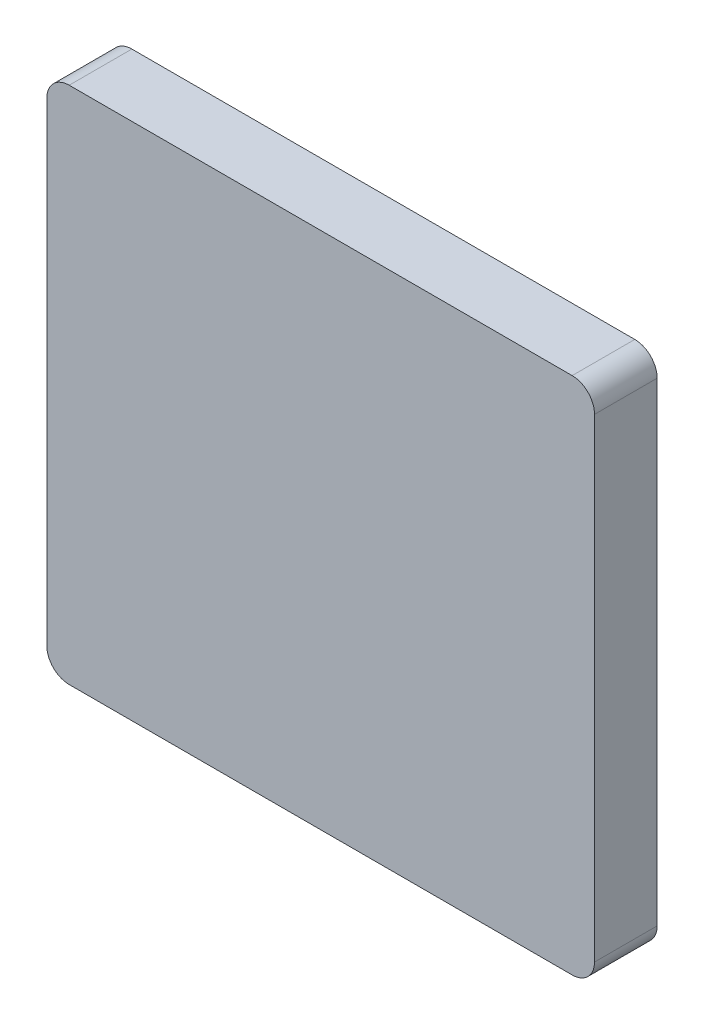
ISO-10303-21;
HEADER;
FILE_DESCRIPTION(('STEP AP214'),'2;1');
FILE_NAME('part.step','',(''),(''),'','','');
FILE_SCHEMA(('AUTOMOTIVE_DESIGN { 1 0 10303 214 1 1 1 1 }'));
ENDSEC;
DATA;
#1=APPLICATION_CONTEXT('core data for automotive mechanical design processes');
#2=APPLICATION_PROTOCOL_DEFINITION('international standard','automotive_design',2000,#1);
#3=PRODUCT_CONTEXT('',#1,'mechanical');
#4=PRODUCT('Part','Part','',(#3));
#5=PRODUCT_RELATED_PRODUCT_CATEGORY('part','',(#4));
#6=PRODUCT_DEFINITION_FORMATION('','',#4);
#7=PRODUCT_DEFINITION_CONTEXT('part definition',#1,'design');
#8=PRODUCT_DEFINITION('design','',#6,#7);
#9=PRODUCT_DEFINITION_SHAPE('','',#8);
#10=(LENGTH_UNIT() NAMED_UNIT(*) SI_UNIT(.MILLI.,.METRE.));
#11=(NAMED_UNIT(*) PLANE_ANGLE_UNIT() SI_UNIT($,.RADIAN.));
#12=(NAMED_UNIT(*) SI_UNIT($,.STERADIAN.) SOLID_ANGLE_UNIT());
#13=UNCERTAINTY_MEASURE_WITH_UNIT(LENGTH_MEASURE(1.E-05),#10,'distance_accuracy_value','');
#14=(GEOMETRIC_REPRESENTATION_CONTEXT(3) GLOBAL_UNCERTAINTY_ASSIGNED_CONTEXT((#13)) GLOBAL_UNIT_ASSIGNED_CONTEXT((#10,
#11,#12)) REPRESENTATION_CONTEXT('',''));
#15=CARTESIAN_POINT('',(0.,0.,0.));
#16=DIRECTION('',(0.,0.,1.));
#17=DIRECTION('',(1.,0.,0.));
#18=AXIS2_PLACEMENT_3D('',#15,#16,#17);
#19=CARTESIAN_POINT('',(165.846153846154,-290.,70.));
#20=DIRECTION('',(-1.,0.,0.));
#21=DIRECTION('',(0.,0.,1.));
#22=AXIS2_PLACEMENT_3D('',#19,#20,#21);
#23=PLANE('',#22);
#24=DIRECTION('',(0.,1.,0.));
#25=VECTOR('',#24,1.);
#26=CARTESIAN_POINT('',(165.846153846154,-290.,0.));
#27=LINE('',#26,#25);
#28=CARTESIAN_POINT('',(165.846153846154,-265.,0.));
#29=VERTEX_POINT('',#28);
#30=CARTESIAN_POINT('',(165.846153846154,265.,0.));
#31=VERTEX_POINT('',#30);
#32=EDGE_CURVE('E134',#29,#31,#27,.T.);
#33=ORIENTED_EDGE('',*,*,#32,.T.);
#34=DIRECTION('',(0.,0.,-1.));
#35=VECTOR('',#34,1.);
#36=CARTESIAN_POINT('',(165.846153846154,265.,70.));
#37=LINE('',#36,#35);
#38=CARTESIAN_POINT('',(165.846153846154,265.,70.));
#39=VERTEX_POINT('',#38);
#40=EDGE_CURVE('E112',#31,#39,#37,.F.);
#41=ORIENTED_EDGE('',*,*,#40,.T.);
#42=DIRECTION('',(0.,1.,0.));
#43=VECTOR('',#42,1.);
#44=CARTESIAN_POINT('',(165.846153846154,-290.,70.));
#45=LINE('',#44,#43);
#46=CARTESIAN_POINT('',(165.846153846154,-265.,70.));
#47=VERTEX_POINT('',#46);
#48=EDGE_CURVE('E143',#47,#39,#45,.T.);
#49=ORIENTED_EDGE('',*,*,#48,.F.);
#50=DIRECTION('',(0.,0.,-1.));
#51=VECTOR('',#50,1.);
#52=CARTESIAN_POINT('',(165.846153846154,-265.,70.));
#53=LINE('',#52,#51);
#54=EDGE_CURVE('E117',#47,#29,#53,.T.);
#55=ORIENTED_EDGE('',*,*,#54,.T.);
#56=EDGE_LOOP('',(#33,#41,#49,#55));
#57=FACE_BOUND('',#56,.T.);
#58=ADVANCED_FACE('F41',(#57),#23,.F.);
#59=CARTESIAN_POINT('',(-446.153846153846,290.,70.));
#60=DIRECTION('',(0.,-1.,0.));
#61=DIRECTION('',(0.,0.,-1.));
#62=AXIS2_PLACEMENT_3D('',#59,#60,#61);
#63=PLANE('',#62);
#64=DIRECTION('',(-1.,0.,0.));
#65=VECTOR('',#64,1.);
#66=CARTESIAN_POINT('',(-446.153846153846,290.,70.));
#67=LINE('',#66,#65);
#68=CARTESIAN_POINT('',(140.846153846154,290.,70.));
#69=VERTEX_POINT('',#68);
#70=CARTESIAN_POINT('',(-421.153846153846,290.,70.));
#71=VERTEX_POINT('',#70);
#72=EDGE_CURVE('E127',#69,#71,#67,.T.);
#73=ORIENTED_EDGE('',*,*,#72,.F.);
#74=DIRECTION('',(0.,0.,-1.));
#75=VECTOR('',#74,1.);
#76=CARTESIAN_POINT('',(140.846153846154,290.,70.));
#77=LINE('',#76,#75);
#78=CARTESIAN_POINT('',(140.846153846154,290.,0.));
#79=VERTEX_POINT('',#78);
#80=EDGE_CURVE('E111',#69,#79,#77,.T.);
#81=ORIENTED_EDGE('',*,*,#80,.T.);
#82=DIRECTION('',(-1.,0.,0.));
#83=VECTOR('',#82,1.);
#84=CARTESIAN_POINT('',(-446.153846153846,290.,0.));
#85=LINE('',#84,#83);
#86=CARTESIAN_POINT('',(-421.153846153846,290.,0.));
#87=VERTEX_POINT('',#86);
#88=EDGE_CURVE('E124',#79,#87,#85,.T.);
#89=ORIENTED_EDGE('',*,*,#88,.T.);
#90=DIRECTION('',(0.,0.,-1.));
#91=VECTOR('',#90,1.);
#92=CARTESIAN_POINT('',(-421.153846153846,290.,70.));
#93=LINE('',#92,#91);
#94=EDGE_CURVE('E129',#87,#71,#93,.F.);
#95=ORIENTED_EDGE('',*,*,#94,.T.);
#96=EDGE_LOOP('',(#73,#81,#89,#95));
#97=FACE_BOUND('',#96,.T.);
#98=ADVANCED_FACE('F123',(#97),#63,.F.);
#99=CARTESIAN_POINT('',(-446.153846153846,-290.,70.));
#100=DIRECTION('',(1.,0.,0.));
#101=DIRECTION('',(0.,0.,-1.));
#102=AXIS2_PLACEMENT_3D('',#99,#100,#101);
#103=PLANE('',#102);
#104=DIRECTION('',(0.,-1.,0.));
#105=VECTOR('',#104,1.);
#106=CARTESIAN_POINT('',(-446.153846153846,-290.,70.));
#107=LINE('',#106,#105);
#108=CARTESIAN_POINT('',(-446.153846153846,265.,70.));
#109=VERTEX_POINT('',#108);
#110=CARTESIAN_POINT('',(-446.153846153846,-265.,70.));
#111=VERTEX_POINT('',#110);
#112=EDGE_CURVE('E169',#109,#111,#107,.T.);
#113=ORIENTED_EDGE('',*,*,#112,.F.);
#114=DIRECTION('',(0.,0.,-1.));
#115=VECTOR('',#114,1.);
#116=CARTESIAN_POINT('',(-446.153846153846,265.,70.));
#117=LINE('',#116,#115);
#118=CARTESIAN_POINT('',(-446.153846153846,265.,0.));
#119=VERTEX_POINT('',#118);
#120=EDGE_CURVE('E162',#109,#119,#117,.T.);
#121=ORIENTED_EDGE('',*,*,#120,.T.);
#122=DIRECTION('',(0.,-1.,0.));
#123=VECTOR('',#122,1.);
#124=CARTESIAN_POINT('',(-446.153846153846,-290.,0.));
#125=LINE('',#124,#123);
#126=CARTESIAN_POINT('',(-446.153846153846,-265.,0.));
#127=VERTEX_POINT('',#126);
#128=EDGE_CURVE('E133',#119,#127,#125,.T.);
#129=ORIENTED_EDGE('',*,*,#128,.T.);
#130=DIRECTION('',(0.,0.,-1.));
#131=VECTOR('',#130,1.);
#132=CARTESIAN_POINT('',(-446.153846153846,-265.,70.));
#133=LINE('',#132,#131);
#134=EDGE_CURVE('E160',#127,#111,#133,.F.);
#135=ORIENTED_EDGE('',*,*,#134,.T.);
#136=EDGE_LOOP('',(#113,#121,#129,#135));
#137=FACE_BOUND('',#136,.T.);
#138=ADVANCED_FACE('F167',(#137),#103,.F.);
#139=CARTESIAN_POINT('',(-446.153846153846,-290.,70.));
#140=DIRECTION('',(0.,1.,0.));
#141=DIRECTION('',(0.,0.,1.));
#142=AXIS2_PLACEMENT_3D('',#139,#140,#141);
#143=PLANE('',#142);
#144=DIRECTION('',(1.,0.,0.));
#145=VECTOR('',#144,1.);
#146=CARTESIAN_POINT('',(-446.153846153846,-290.,70.));
#147=LINE('',#146,#145);
#148=CARTESIAN_POINT('',(-421.153846153846,-290.,70.));
#149=VERTEX_POINT('',#148);
#150=CARTESIAN_POINT('',(140.846153846154,-290.,70.));
#151=VERTEX_POINT('',#150);
#152=EDGE_CURVE('E144',#149,#151,#147,.T.);
#153=ORIENTED_EDGE('',*,*,#152,.F.);
#154=DIRECTION('',(0.,0.,-1.));
#155=VECTOR('',#154,1.);
#156=CARTESIAN_POINT('',(-421.153846153846,-290.,70.));
#157=LINE('',#156,#155);
#158=CARTESIAN_POINT('',(-421.153846153846,-290.,0.));
#159=VERTEX_POINT('',#158);
#160=EDGE_CURVE('E11',#149,#159,#157,.T.);
#161=ORIENTED_EDGE('',*,*,#160,.T.);
#162=DIRECTION('',(1.,0.,0.));
#163=VECTOR('',#162,1.);
#164=CARTESIAN_POINT('',(-446.153846153846,-290.,0.));
#165=LINE('',#164,#163);
#166=CARTESIAN_POINT('',(140.846153846154,-290.,0.));
#167=VERTEX_POINT('',#166);
#168=EDGE_CURVE('E137',#159,#167,#165,.T.);
#169=ORIENTED_EDGE('',*,*,#168,.T.);
#170=DIRECTION('',(0.,0.,-1.));
#171=VECTOR('',#170,1.);
#172=CARTESIAN_POINT('',(140.846153846154,-290.,70.));
#173=LINE('',#172,#171);
#174=EDGE_CURVE('E49',#167,#151,#173,.F.);
#175=ORIENTED_EDGE('',*,*,#174,.T.);
#176=EDGE_LOOP('',(#153,#161,#169,#175));
#177=FACE_BOUND('',#176,.T.);
#178=ADVANCED_FACE('F176',(#177),#143,.F.);
#179=CARTESIAN_POINT('',(0.,0.,70.));
#180=DIRECTION('',(0.,0.,-1.));
#181=DIRECTION('',(-1.,0.,0.));
#182=AXIS2_PLACEMENT_3D('',#179,#180,#181);
#183=PLANE('',#182);
#184=ORIENTED_EDGE('',*,*,#48,.T.);
#185=CARTESIAN_POINT('',(140.846153846154,265.,70.));
#186=DIRECTION('',(0.,0.,-1.));
#187=DIRECTION('',(-1.,0.,0.));
#188=AXIS2_PLACEMENT_3D('',#185,#186,#187);
#189=CIRCLE('',#188,25.);
#190=EDGE_CURVE('E158',#39,#69,#189,.F.);
#191=ORIENTED_EDGE('',*,*,#190,.T.);
#192=ORIENTED_EDGE('',*,*,#72,.T.);
#193=CARTESIAN_POINT('',(-421.153846153846,265.,70.));
#194=DIRECTION('',(0.,0.,-1.));
#195=DIRECTION('',(-1.,0.,0.));
#196=AXIS2_PLACEMENT_3D('',#193,#194,#195);
#197=CIRCLE('',#196,25.);
#198=EDGE_CURVE('E156',#71,#109,#197,.F.);
#199=ORIENTED_EDGE('',*,*,#198,.T.);
#200=ORIENTED_EDGE('',*,*,#112,.T.);
#201=CARTESIAN_POINT('',(-421.153846153846,-265.,70.));
#202=DIRECTION('',(0.,0.,-1.));
#203=DIRECTION('',(-1.,0.,0.));
#204=AXIS2_PLACEMENT_3D('',#201,#202,#203);
#205=CIRCLE('',#204,25.);
#206=EDGE_CURVE('E62',#111,#149,#205,.F.);
#207=ORIENTED_EDGE('',*,*,#206,.T.);
#208=ORIENTED_EDGE('',*,*,#152,.T.);
#209=CARTESIAN_POINT('',(140.846153846154,-265.,70.));
#210=DIRECTION('',(0.,0.,-1.));
#211=DIRECTION('',(-1.,0.,0.));
#212=AXIS2_PLACEMENT_3D('',#209,#210,#211);
#213=CIRCLE('',#212,25.);
#214=EDGE_CURVE('E153',#151,#47,#213,.F.);
#215=ORIENTED_EDGE('',*,*,#214,.T.);
#216=EDGE_LOOP('',(#184,#191,#192,#199,#200,#207,#208,#215));
#217=FACE_BOUND('',#216,.T.);
#218=ADVANCED_FACE('F183',(#217),#183,.F.);
#219=CARTESIAN_POINT('',(0.,0.,0.));
#220=DIRECTION('',(0.,0.,-1.));
#221=DIRECTION('',(-1.,0.,0.));
#222=AXIS2_PLACEMENT_3D('',#219,#220,#221);
#223=PLANE('',#222);
#224=ORIENTED_EDGE('',*,*,#88,.F.);
#225=CARTESIAN_POINT('',(140.846153846154,265.,0.));
#226=DIRECTION('',(0.,0.,-1.));
#227=DIRECTION('',(-1.,0.,0.));
#228=AXIS2_PLACEMENT_3D('',#225,#226,#227);
#229=CIRCLE('',#228,25.);
#230=EDGE_CURVE('E107',#79,#31,#229,.T.);
#231=ORIENTED_EDGE('',*,*,#230,.T.);
#232=ORIENTED_EDGE('',*,*,#32,.F.);
#233=CARTESIAN_POINT('',(140.846153846154,-265.,0.));
#234=DIRECTION('',(0.,0.,-1.));
#235=DIRECTION('',(-1.,0.,0.));
#236=AXIS2_PLACEMENT_3D('',#233,#234,#235);
#237=CIRCLE('',#236,25.);
#238=EDGE_CURVE('E128',#29,#167,#237,.T.);
#239=ORIENTED_EDGE('',*,*,#238,.T.);
#240=ORIENTED_EDGE('',*,*,#168,.F.);
#241=CARTESIAN_POINT('',(-421.153846153846,-265.,0.));
#242=DIRECTION('',(0.,0.,-1.));
#243=DIRECTION('',(-1.,0.,0.));
#244=AXIS2_PLACEMENT_3D('',#241,#242,#243);
#245=CIRCLE('',#244,25.);
#246=EDGE_CURVE('E147',#159,#127,#245,.T.);
#247=ORIENTED_EDGE('',*,*,#246,.T.);
#248=ORIENTED_EDGE('',*,*,#128,.F.);
#249=CARTESIAN_POINT('',(-421.153846153846,265.,0.));
#250=DIRECTION('',(0.,0.,-1.));
#251=DIRECTION('',(-1.,0.,0.));
#252=AXIS2_PLACEMENT_3D('',#249,#250,#251);
#253=CIRCLE('',#252,25.);
#254=EDGE_CURVE('E118',#119,#87,#253,.T.);
#255=ORIENTED_EDGE('',*,*,#254,.T.);
#256=EDGE_LOOP('',(#224,#231,#232,#239,#240,#247,#248,#255));
#257=FACE_BOUND('',#256,.T.);
#258=ADVANCED_FACE('F131',(#257),#223,.T.);
#259=CARTESIAN_POINT('',(140.846153846154,265.,70.));
#260=DIRECTION('',(0.,0.,-1.));
#261=DIRECTION('',(-1.,0.,0.));
#262=AXIS2_PLACEMENT_3D('',#259,#260,#261);
#263=CYLINDRICAL_SURFACE('',#262,25.);
#264=ORIENTED_EDGE('',*,*,#190,.F.);
#265=ORIENTED_EDGE('',*,*,#40,.F.);
#266=ORIENTED_EDGE('',*,*,#230,.F.);
#267=ORIENTED_EDGE('',*,*,#80,.F.);
#268=EDGE_LOOP('',(#264,#265,#266,#267));
#269=FACE_BOUND('',#268,.T.);
#270=ADVANCED_FACE('F110',(#269),#263,.T.);
#271=CARTESIAN_POINT('',(-421.153846153846,265.,70.));
#272=DIRECTION('',(0.,0.,-1.));
#273=DIRECTION('',(-1.,0.,0.));
#274=AXIS2_PLACEMENT_3D('',#271,#272,#273);
#275=CYLINDRICAL_SURFACE('',#274,25.);
#276=ORIENTED_EDGE('',*,*,#198,.F.);
#277=ORIENTED_EDGE('',*,*,#94,.F.);
#278=ORIENTED_EDGE('',*,*,#254,.F.);
#279=ORIENTED_EDGE('',*,*,#120,.F.);
#280=EDGE_LOOP('',(#276,#277,#278,#279));
#281=FACE_BOUND('',#280,.T.);
#282=ADVANCED_FACE('F191',(#281),#275,.T.);
#283=CARTESIAN_POINT('',(-421.153846153846,-265.,70.));
#284=DIRECTION('',(0.,0.,-1.));
#285=DIRECTION('',(-1.,0.,0.));
#286=AXIS2_PLACEMENT_3D('',#283,#284,#285);
#287=CYLINDRICAL_SURFACE('',#286,25.);
#288=ORIENTED_EDGE('',*,*,#206,.F.);
#289=ORIENTED_EDGE('',*,*,#134,.F.);
#290=ORIENTED_EDGE('',*,*,#246,.F.);
#291=ORIENTED_EDGE('',*,*,#160,.F.);
#292=EDGE_LOOP('',(#288,#289,#290,#291));
#293=FACE_BOUND('',#292,.T.);
#294=ADVANCED_FACE('F175',(#293),#287,.T.);
#295=CARTESIAN_POINT('',(140.846153846154,-265.,70.));
#296=DIRECTION('',(0.,0.,-1.));
#297=DIRECTION('',(-1.,0.,0.));
#298=AXIS2_PLACEMENT_3D('',#295,#296,#297);
#299=CYLINDRICAL_SURFACE('',#298,25.);
#300=ORIENTED_EDGE('',*,*,#214,.F.);
#301=ORIENTED_EDGE('',*,*,#174,.F.);
#302=ORIENTED_EDGE('',*,*,#238,.F.);
#303=ORIENTED_EDGE('',*,*,#54,.F.);
#304=EDGE_LOOP('',(#300,#301,#302,#303));
#305=FACE_BOUND('',#304,.T.);
#306=ADVANCED_FACE('F43',(#305),#299,.T.);
#307=CLOSED_SHELL('',(#58,#98,#138,#178,#218,#258,#270,#282,#294,#306));
#308=MANIFOLD_SOLID_BREP('B2',#307);
#309=ADVANCED_BREP_SHAPE_REPRESENTATION('',(#18,#308),#14);
#310=SHAPE_DEFINITION_REPRESENTATION(#9,#309);
ENDSEC;
END-ISO-10303-21;
